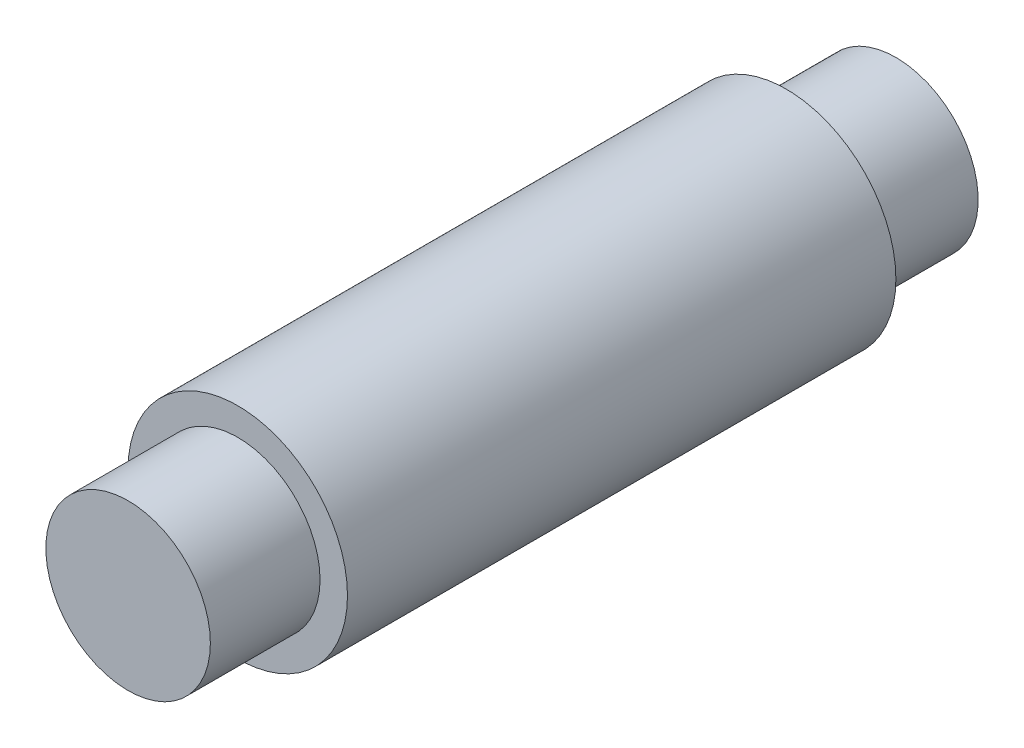
ISO-10303-21;
HEADER;
FILE_DESCRIPTION(('STEP AP214'),'2;1');
FILE_NAME('part.step','',(''),(''),'','','');
FILE_SCHEMA(('AUTOMOTIVE_DESIGN { 1 0 10303 214 1 1 1 1 }'));
ENDSEC;
DATA;
#1=APPLICATION_CONTEXT('core data for automotive mechanical design processes');
#2=APPLICATION_PROTOCOL_DEFINITION('international standard','automotive_design',2000,#1);
#3=PRODUCT_CONTEXT('',#1,'mechanical');
#4=PRODUCT('Part','Part','',(#3));
#5=PRODUCT_RELATED_PRODUCT_CATEGORY('part','',(#4));
#6=PRODUCT_DEFINITION_FORMATION('','',#4);
#7=PRODUCT_DEFINITION_CONTEXT('part definition',#1,'design');
#8=PRODUCT_DEFINITION('design','',#6,#7);
#9=PRODUCT_DEFINITION_SHAPE('','',#8);
#10=(LENGTH_UNIT() NAMED_UNIT(*) SI_UNIT(.MILLI.,.METRE.));
#11=(NAMED_UNIT(*) PLANE_ANGLE_UNIT() SI_UNIT($,.RADIAN.));
#12=(NAMED_UNIT(*) SI_UNIT($,.STERADIAN.) SOLID_ANGLE_UNIT());
#13=UNCERTAINTY_MEASURE_WITH_UNIT(LENGTH_MEASURE(1.E-05),#10,'distance_accuracy_value','');
#14=(GEOMETRIC_REPRESENTATION_CONTEXT(3) GLOBAL_UNCERTAINTY_ASSIGNED_CONTEXT((#13)) GLOBAL_UNIT_ASSIGNED_CONTEXT((#10,
#11,#12)) REPRESENTATION_CONTEXT('',''));
#15=CARTESIAN_POINT('',(0.,0.,0.));
#16=DIRECTION('',(0.,0.,1.));
#17=DIRECTION('',(1.,0.,0.));
#18=AXIS2_PLACEMENT_3D('',#15,#16,#17);
#19=CARTESIAN_POINT('',(0.,0.,-44.45));
#20=DIRECTION('',(0.,0.,1.));
#21=DIRECTION('',(1.,0.,0.));
#22=AXIS2_PLACEMENT_3D('',#19,#20,#21);
#23=CYLINDRICAL_SURFACE('',#22,12.7);
#24=CARTESIAN_POINT('',(0.,0.,31.75));
#25=DIRECTION('',(0.,0.,1.));
#26=DIRECTION('',(1.,0.,0.));
#27=AXIS2_PLACEMENT_3D('',#24,#25,#26);
#28=CIRCLE('',#27,12.7);
#29=CARTESIAN_POINT('',(12.7,0.,31.75));
#30=VERTEX_POINT('',#29);
#31=EDGE_CURVE('E10',#30,#30,#28,.T.);
#32=ORIENTED_EDGE('',*,*,#31,.F.);
#33=EDGE_LOOP('',(#32));
#34=FACE_BOUND('',#33,.T.);
#35=CARTESIAN_POINT('',(0.,0.,-31.75));
#36=DIRECTION('',(0.,0.,-1.));
#37=DIRECTION('',(-1.,0.,0.));
#38=AXIS2_PLACEMENT_3D('',#35,#36,#37);
#39=CIRCLE('',#38,12.7);
#40=CARTESIAN_POINT('',(-12.7,0.,-31.75));
#41=VERTEX_POINT('',#40);
#42=EDGE_CURVE('E54',#41,#41,#39,.T.);
#43=ORIENTED_EDGE('',*,*,#42,.F.);
#44=EDGE_LOOP('',(#43));
#45=FACE_BOUND('',#44,.T.);
#46=ADVANCED_FACE('F36',(#34,#45),#23,.T.);
#47=CARTESIAN_POINT('',(0.,0.,31.75));
#48=DIRECTION('',(0.,0.,1.));
#49=DIRECTION('',(1.,0.,0.));
#50=AXIS2_PLACEMENT_3D('',#47,#48,#49);
#51=PLANE('',#50);
#52=CARTESIAN_POINT('',(0.,0.,31.75));
#53=DIRECTION('',(0.,0.,1.));
#54=DIRECTION('',(1.,0.,0.));
#55=AXIS2_PLACEMENT_3D('',#52,#53,#54);
#56=CIRCLE('',#55,9.525);
#57=CARTESIAN_POINT('',(9.525,0.,31.75));
#58=VERTEX_POINT('',#57);
#59=EDGE_CURVE('E43',#58,#58,#56,.T.);
#60=ORIENTED_EDGE('',*,*,#59,.F.);
#61=EDGE_LOOP('',(#60));
#62=FACE_BOUND('',#61,.T.);
#63=ORIENTED_EDGE('',*,*,#31,.T.);
#64=EDGE_LOOP('',(#63));
#65=FACE_BOUND('',#64,.T.);
#66=ADVANCED_FACE('F79',(#62,#65),#51,.T.);
#67=CARTESIAN_POINT('',(0.,0.,31.75));
#68=DIRECTION('',(0.,0.,1.));
#69=DIRECTION('',(1.,0.,0.));
#70=AXIS2_PLACEMENT_3D('',#67,#68,#69);
#71=CYLINDRICAL_SURFACE('',#70,9.525);
#72=ORIENTED_EDGE('',*,*,#59,.T.);
#73=EDGE_LOOP('',(#72));
#74=FACE_BOUND('',#73,.T.);
#75=CARTESIAN_POINT('',(0.,0.,44.45));
#76=DIRECTION('',(0.,0.,1.));
#77=DIRECTION('',(1.,0.,0.));
#78=AXIS2_PLACEMENT_3D('',#75,#76,#77);
#79=CIRCLE('',#78,9.525);
#80=CARTESIAN_POINT('',(9.525,0.,44.45));
#81=VERTEX_POINT('',#80);
#82=EDGE_CURVE('E48',#81,#81,#79,.T.);
#83=ORIENTED_EDGE('',*,*,#82,.F.);
#84=EDGE_LOOP('',(#83));
#85=FACE_BOUND('',#84,.T.);
#86=ADVANCED_FACE('F86',(#74,#85),#71,.T.);
#87=CARTESIAN_POINT('',(0.,0.,44.45));
#88=DIRECTION('',(0.,0.,1.));
#89=DIRECTION('',(1.,0.,0.));
#90=AXIS2_PLACEMENT_3D('',#87,#88,#89);
#91=PLANE('',#90);
#92=ORIENTED_EDGE('',*,*,#82,.T.);
#93=EDGE_LOOP('',(#92));
#94=FACE_BOUND('',#93,.T.);
#95=ADVANCED_FACE('F74',(#94),#91,.T.);
#96=CARTESIAN_POINT('',(0.,0.,-31.75));
#97=DIRECTION('',(0.,0.,-1.));
#98=DIRECTION('',(-1.,0.,0.));
#99=AXIS2_PLACEMENT_3D('',#96,#97,#98);
#100=PLANE('',#99);
#101=CARTESIAN_POINT('',(0.,0.,-31.75));
#102=DIRECTION('',(0.,0.,-1.));
#103=DIRECTION('',(-1.,0.,0.));
#104=AXIS2_PLACEMENT_3D('',#101,#102,#103);
#105=CIRCLE('',#104,9.525);
#106=CARTESIAN_POINT('',(-9.525,0.,-31.75));
#107=VERTEX_POINT('',#106);
#108=EDGE_CURVE('E59',#107,#107,#105,.T.);
#109=ORIENTED_EDGE('',*,*,#108,.F.);
#110=EDGE_LOOP('',(#109));
#111=FACE_BOUND('',#110,.T.);
#112=ORIENTED_EDGE('',*,*,#42,.T.);
#113=EDGE_LOOP('',(#112));
#114=FACE_BOUND('',#113,.T.);
#115=ADVANCED_FACE('F71',(#111,#114),#100,.T.);
#116=CARTESIAN_POINT('',(0.,0.,-31.75));
#117=DIRECTION('',(0.,0.,-1.));
#118=DIRECTION('',(-1.,0.,0.));
#119=AXIS2_PLACEMENT_3D('',#116,#117,#118);
#120=CYLINDRICAL_SURFACE('',#119,9.525);
#121=ORIENTED_EDGE('',*,*,#108,.T.);
#122=EDGE_LOOP('',(#121));
#123=FACE_BOUND('',#122,.T.);
#124=CARTESIAN_POINT('',(0.,0.,-44.45));
#125=DIRECTION('',(0.,0.,-1.));
#126=DIRECTION('',(-1.,0.,0.));
#127=AXIS2_PLACEMENT_3D('',#124,#125,#126);
#128=CIRCLE('',#127,9.525);
#129=CARTESIAN_POINT('',(-9.525,0.,-44.45));
#130=VERTEX_POINT('',#129);
#131=EDGE_CURVE('E60',#130,#130,#128,.T.);
#132=ORIENTED_EDGE('',*,*,#131,.F.);
#133=EDGE_LOOP('',(#132));
#134=FACE_BOUND('',#133,.T.);
#135=ADVANCED_FACE('F68',(#123,#134),#120,.T.);
#136=CARTESIAN_POINT('',(0.,0.,-44.45));
#137=DIRECTION('',(0.,0.,1.));
#138=DIRECTION('',(1.,0.,0.));
#139=AXIS2_PLACEMENT_3D('',#136,#137,#138);
#140=PLANE('',#139);
#141=ORIENTED_EDGE('',*,*,#131,.T.);
#142=EDGE_LOOP('',(#141));
#143=FACE_BOUND('',#142,.T.);
#144=ADVANCED_FACE('F94',(#143),#140,.F.);
#145=CLOSED_SHELL('',(#46,#66,#86,#95,#115,#135,#144));
#146=MANIFOLD_SOLID_BREP('B2',#145);
#147=ADVANCED_BREP_SHAPE_REPRESENTATION('',(#18,#146),#14);
#148=SHAPE_DEFINITION_REPRESENTATION(#9,#147);
ENDSEC;
END-ISO-10303-21;
